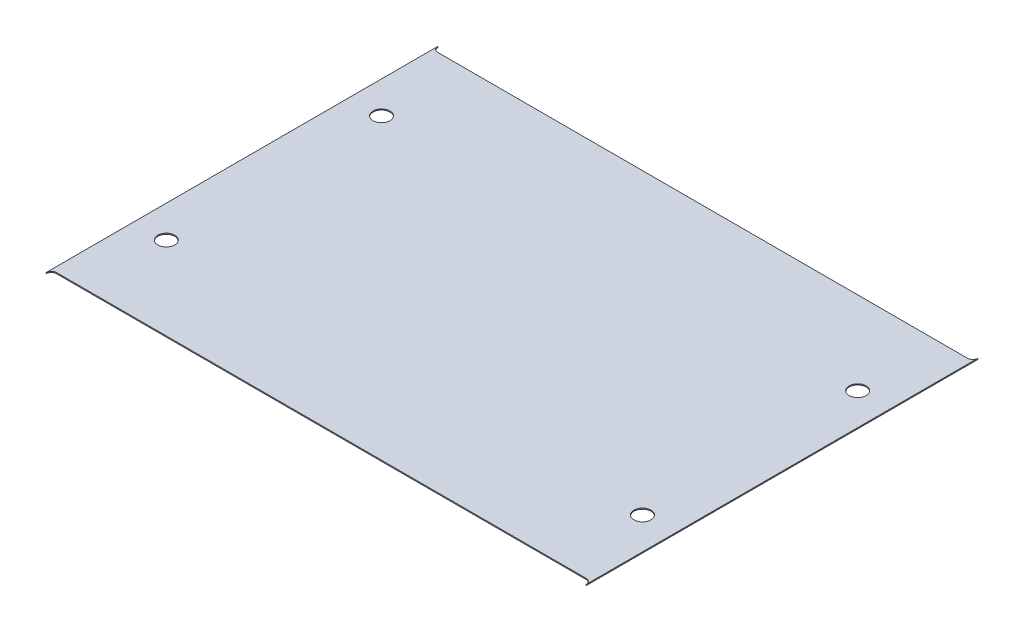
ISO-10303-21;
HEADER;
FILE_DESCRIPTION(('STEP AP214'),'2;1');
FILE_NAME('part.step','',(''),(''),'','','');
FILE_SCHEMA(('AUTOMOTIVE_DESIGN { 1 0 10303 214 1 1 1 1 }'));
ENDSEC;
DATA;
#1=APPLICATION_CONTEXT('core data for automotive mechanical design processes');
#2=APPLICATION_PROTOCOL_DEFINITION('international standard','automotive_design',2000,#1);
#3=PRODUCT_CONTEXT('',#1,'mechanical');
#4=PRODUCT('Part','Part','',(#3));
#5=PRODUCT_RELATED_PRODUCT_CATEGORY('part','',(#4));
#6=PRODUCT_DEFINITION_FORMATION('','',#4);
#7=PRODUCT_DEFINITION_CONTEXT('part definition',#1,'design');
#8=PRODUCT_DEFINITION('design','',#6,#7);
#9=PRODUCT_DEFINITION_SHAPE('','',#8);
#10=(LENGTH_UNIT() NAMED_UNIT(*) SI_UNIT(.MILLI.,.METRE.));
#11=(NAMED_UNIT(*) PLANE_ANGLE_UNIT() SI_UNIT($,.RADIAN.));
#12=(NAMED_UNIT(*) SI_UNIT($,.STERADIAN.) SOLID_ANGLE_UNIT());
#13=UNCERTAINTY_MEASURE_WITH_UNIT(LENGTH_MEASURE(1.E-05),#10,'distance_accuracy_value','');
#14=(GEOMETRIC_REPRESENTATION_CONTEXT(3) GLOBAL_UNCERTAINTY_ASSIGNED_CONTEXT((#13)) GLOBAL_UNIT_ASSIGNED_CONTEXT((#10,
#11,#12)) REPRESENTATION_CONTEXT('',''));
#15=CARTESIAN_POINT('',(0.,0.,0.));
#16=DIRECTION('',(0.,0.,1.));
#17=DIRECTION('',(1.,0.,0.));
#18=AXIS2_PLACEMENT_3D('',#15,#16,#17);
#19=CARTESIAN_POINT('',(-49.4289039708922,0.1,-21.9312755867609));
#20=DIRECTION('',(0.,1.,0.));
#21=DIRECTION('',(0.,0.,1.));
#22=AXIS2_PLACEMENT_3D('',#19,#20,#21);
#23=PLANE('',#22);
#24=CARTESIAN_POINT('',(-46.9089039708922,0.1,6.72872441323915));
#25=DIRECTION('',(0.,1.,0.));
#26=DIRECTION('',(0.,0.,1.));
#27=AXIS2_PLACEMENT_3D('',#24,#25,#26);
#28=CIRCLE('',#27,0.799999999999995);
#29=CARTESIAN_POINT('',(-46.9089039708922,0.1,7.52872441323914));
#30=VERTEX_POINT('',#29);
#31=EDGE_CURVE('E188',#30,#30,#28,.T.);
#32=ORIENTED_EDGE('',*,*,#31,.F.);
#33=EDGE_LOOP('',(#32));
#34=FACE_BOUND('',#33,.T.);
#35=CARTESIAN_POINT('',(-1.94890397089222,0.1,-13.5912755867609));
#36=DIRECTION('',(0.,1.,0.));
#37=DIRECTION('',(0.,0.,1.));
#38=AXIS2_PLACEMENT_3D('',#35,#36,#37);
#39=CIRCLE('',#38,0.799999999999999);
#40=CARTESIAN_POINT('',(-1.94890397089222,0.1,-12.7912755867609));
#41=VERTEX_POINT('',#40);
#42=EDGE_CURVE('E134',#41,#41,#39,.T.);
#43=ORIENTED_EDGE('',*,*,#42,.F.);
#44=EDGE_LOOP('',(#43));
#45=FACE_BOUND('',#44,.T.);
#46=CARTESIAN_POINT('',(-49.4289039708922,0.1,-21.9312755867609));
#47=DIRECTION('',(0.,-1.,0.));
#48=DIRECTION('',(0.,0.,1.));
#49=AXIS2_PLACEMENT_3D('',#46,#47,#48);
#50=CIRCLE('',#49,0.500000000000002);
#51=CARTESIAN_POINT('',(-49.4289039708922,0.1,-21.4312755867609));
#52=VERTEX_POINT('',#51);
#53=CARTESIAN_POINT('',(-49.9289039708922,0.1,-21.9312755867609));
#54=VERTEX_POINT('',#53);
#55=EDGE_CURVE('E145',#52,#54,#50,.T.);
#56=ORIENTED_EDGE('',*,*,#55,.T.);
#57=DIRECTION('',(0.,0.,1.));
#58=VECTOR('',#57,1.);
#59=CARTESIAN_POINT('',(-49.9289039708922,0.1,-21.9312755867609));
#60=LINE('',#59,#58);
#61=CARTESIAN_POINT('',(-49.9289039708922,0.1,15.0687244132391));
#62=VERTEX_POINT('',#61);
#63=EDGE_CURVE('E93',#54,#62,#60,.T.);
#64=ORIENTED_EDGE('',*,*,#63,.T.);
#65=CARTESIAN_POINT('',(-49.4289039708922,0.1,15.0687244132391));
#66=DIRECTION('',(0.,-1.,0.));
#67=DIRECTION('',(0.,0.,1.));
#68=AXIS2_PLACEMENT_3D('',#65,#66,#67);
#69=CIRCLE('',#68,0.5);
#70=CARTESIAN_POINT('',(-49.4289039708922,0.1,14.5687244132391));
#71=VERTEX_POINT('',#70);
#72=EDGE_CURVE('E160',#62,#71,#69,.T.);
#73=ORIENTED_EDGE('',*,*,#72,.T.);
#74=DIRECTION('',(1.,0.,0.));
#75=VECTOR('',#74,1.);
#76=CARTESIAN_POINT('',(-49.4289039708922,0.1,14.5687244132391));
#77=LINE('',#76,#75);
#78=CARTESIAN_POINT('',(0.571096029107789,0.1,14.5687244132391));
#79=VERTEX_POINT('',#78);
#80=EDGE_CURVE('E173',#71,#79,#77,.T.);
#81=ORIENTED_EDGE('',*,*,#80,.T.);
#82=CARTESIAN_POINT('',(0.571096029107789,0.1,15.0687244132391));
#83=DIRECTION('',(0.,-1.,0.));
#84=DIRECTION('',(0.,0.,1.));
#85=AXIS2_PLACEMENT_3D('',#82,#83,#84);
#86=CIRCLE('',#85,0.5);
#87=CARTESIAN_POINT('',(1.07109602910779,0.1,15.0687244132391));
#88=VERTEX_POINT('',#87);
#89=EDGE_CURVE('E112',#79,#88,#86,.T.);
#90=ORIENTED_EDGE('',*,*,#89,.T.);
#91=DIRECTION('',(0.,0.,-1.));
#92=VECTOR('',#91,1.);
#93=CARTESIAN_POINT('',(1.07109602910779,0.1,15.0687244132391));
#94=LINE('',#93,#92);
#95=CARTESIAN_POINT('',(1.07109602910779,0.1,-21.9312755867609));
#96=VERTEX_POINT('',#95);
#97=EDGE_CURVE('E106',#88,#96,#94,.T.);
#98=ORIENTED_EDGE('',*,*,#97,.T.);
#99=CARTESIAN_POINT('',(0.571096029107789,0.1,-21.9312755867609));
#100=DIRECTION('',(0.,-1.,0.));
#101=DIRECTION('',(0.,0.,1.));
#102=AXIS2_PLACEMENT_3D('',#99,#100,#101);
#103=CIRCLE('',#102,0.500000000000004);
#104=CARTESIAN_POINT('',(0.571096029107789,0.1,-21.4312755867609));
#105=VERTEX_POINT('',#104);
#106=EDGE_CURVE('E110',#96,#105,#103,.T.);
#107=ORIENTED_EDGE('',*,*,#106,.T.);
#108=DIRECTION('',(-1.,0.,0.));
#109=VECTOR('',#108,1.);
#110=CARTESIAN_POINT('',(0.571096029107789,0.1,-21.4312755867609));
#111=LINE('',#110,#109);
#112=EDGE_CURVE('E50',#105,#52,#111,.T.);
#113=ORIENTED_EDGE('',*,*,#112,.T.);
#114=EDGE_LOOP('',(#56,#64,#73,#81,#90,#98,#107,#113));
#115=FACE_BOUND('',#114,.T.);
#116=CARTESIAN_POINT('',(-46.9089039708922,0.1,-13.5912755867609));
#117=DIRECTION('',(0.,1.,0.));
#118=DIRECTION('',(0.,0.,1.));
#119=AXIS2_PLACEMENT_3D('',#116,#117,#118);
#120=CIRCLE('',#119,0.799999999999995);
#121=CARTESIAN_POINT('',(-46.9089039708922,0.1,-12.7912755867609));
#122=VERTEX_POINT('',#121);
#123=EDGE_CURVE('E182',#122,#122,#120,.T.);
#124=ORIENTED_EDGE('',*,*,#123,.F.);
#125=EDGE_LOOP('',(#124));
#126=FACE_BOUND('',#125,.T.);
#127=CARTESIAN_POINT('',(-1.94890397089221,0.1,6.72872441323915));
#128=DIRECTION('',(0.,1.,0.));
#129=DIRECTION('',(0.,0.,1.));
#130=AXIS2_PLACEMENT_3D('',#127,#128,#129);
#131=CIRCLE('',#130,0.799999999999998);
#132=CARTESIAN_POINT('',(-1.94890397089221,0.1,7.52872441323914));
#133=VERTEX_POINT('',#132);
#134=EDGE_CURVE('E194',#133,#133,#131,.T.);
#135=ORIENTED_EDGE('',*,*,#134,.F.);
#136=EDGE_LOOP('',(#135));
#137=FACE_BOUND('',#136,.T.);
#138=ADVANCED_FACE('F33',(#34,#45,#115,#126,#137),#23,.T.);
#139=CARTESIAN_POINT('',(-49.4289039708922,0.,-21.9312755867609));
#140=DIRECTION('',(0.,1.,0.));
#141=DIRECTION('',(0.,0.,1.));
#142=AXIS2_PLACEMENT_3D('',#139,#140,#141);
#143=PLANE('',#142);
#144=CARTESIAN_POINT('',(-49.4289039708922,0.,-21.9312755867609));
#145=DIRECTION('',(0.,-1.,0.));
#146=DIRECTION('',(0.,0.,1.));
#147=AXIS2_PLACEMENT_3D('',#144,#145,#146);
#148=CIRCLE('',#147,0.500000000000002);
#149=CARTESIAN_POINT('',(-49.4289039708922,0.,-21.4312755867609));
#150=VERTEX_POINT('',#149);
#151=CARTESIAN_POINT('',(-49.9289039708922,0.,-21.9312755867609));
#152=VERTEX_POINT('',#151);
#153=EDGE_CURVE('E130',#150,#152,#148,.T.);
#154=ORIENTED_EDGE('',*,*,#153,.F.);
#155=DIRECTION('',(-1.,0.,0.));
#156=VECTOR('',#155,1.);
#157=CARTESIAN_POINT('',(0.571096029107789,0.,-21.4312755867609));
#158=LINE('',#157,#156);
#159=CARTESIAN_POINT('',(0.571096029107789,0.,-21.4312755867609));
#160=VERTEX_POINT('',#159);
#161=EDGE_CURVE('E85',#160,#150,#158,.T.);
#162=ORIENTED_EDGE('',*,*,#161,.F.);
#163=CARTESIAN_POINT('',(0.571096029107789,0.,-21.9312755867609));
#164=DIRECTION('',(0.,-1.,0.));
#165=DIRECTION('',(0.,0.,1.));
#166=AXIS2_PLACEMENT_3D('',#163,#164,#165);
#167=CIRCLE('',#166,0.500000000000004);
#168=CARTESIAN_POINT('',(1.07109602910779,0.,-21.9312755867609));
#169=VERTEX_POINT('',#168);
#170=EDGE_CURVE('E79',#169,#160,#167,.T.);
#171=ORIENTED_EDGE('',*,*,#170,.F.);
#172=DIRECTION('',(0.,0.,-1.));
#173=VECTOR('',#172,1.);
#174=CARTESIAN_POINT('',(1.07109602910779,0.,15.0687244132391));
#175=LINE('',#174,#173);
#176=CARTESIAN_POINT('',(1.07109602910779,0.,15.0687244132391));
#177=VERTEX_POINT('',#176);
#178=EDGE_CURVE('E120',#177,#169,#175,.T.);
#179=ORIENTED_EDGE('',*,*,#178,.F.);
#180=CARTESIAN_POINT('',(0.571096029107789,0.,15.0687244132391));
#181=DIRECTION('',(0.,-1.,0.));
#182=DIRECTION('',(0.,0.,1.));
#183=AXIS2_PLACEMENT_3D('',#180,#181,#182);
#184=CIRCLE('',#183,0.5);
#185=CARTESIAN_POINT('',(0.571096029107789,0.,14.5687244132391));
#186=VERTEX_POINT('',#185);
#187=EDGE_CURVE('E140',#186,#177,#184,.T.);
#188=ORIENTED_EDGE('',*,*,#187,.F.);
#189=DIRECTION('',(1.,0.,0.));
#190=VECTOR('',#189,1.);
#191=CARTESIAN_POINT('',(-49.4289039708922,0.,14.5687244132391));
#192=LINE('',#191,#190);
#193=CARTESIAN_POINT('',(-49.4289039708922,0.,14.5687244132391));
#194=VERTEX_POINT('',#193);
#195=EDGE_CURVE('E138',#194,#186,#192,.T.);
#196=ORIENTED_EDGE('',*,*,#195,.F.);
#197=CARTESIAN_POINT('',(-49.4289039708922,0.,15.0687244132391));
#198=DIRECTION('',(0.,-1.,0.));
#199=DIRECTION('',(0.,0.,1.));
#200=AXIS2_PLACEMENT_3D('',#197,#198,#199);
#201=CIRCLE('',#200,0.5);
#202=CARTESIAN_POINT('',(-49.9289039708922,0.,15.0687244132391));
#203=VERTEX_POINT('',#202);
#204=EDGE_CURVE('E136',#203,#194,#201,.T.);
#205=ORIENTED_EDGE('',*,*,#204,.F.);
#206=DIRECTION('',(0.,0.,1.));
#207=VECTOR('',#206,1.);
#208=CARTESIAN_POINT('',(-49.9289039708922,0.,-21.9312755867609));
#209=LINE('',#208,#207);
#210=EDGE_CURVE('E133',#152,#203,#209,.T.);
#211=ORIENTED_EDGE('',*,*,#210,.F.);
#212=EDGE_LOOP('',(#154,#162,#171,#179,#188,#196,#205,#211));
#213=FACE_BOUND('',#212,.T.);
#214=CARTESIAN_POINT('',(-1.94890397089222,0.,-13.5912755867609));
#215=DIRECTION('',(0.,1.,0.));
#216=DIRECTION('',(0.,0.,1.));
#217=AXIS2_PLACEMENT_3D('',#214,#215,#216);
#218=CIRCLE('',#217,0.799999999999999);
#219=CARTESIAN_POINT('',(-1.94890397089222,0.,-12.7912755867609));
#220=VERTEX_POINT('',#219);
#221=EDGE_CURVE('E179',#220,#220,#218,.T.);
#222=ORIENTED_EDGE('',*,*,#221,.T.);
#223=EDGE_LOOP('',(#222));
#224=FACE_BOUND('',#223,.T.);
#225=CARTESIAN_POINT('',(-46.9089039708922,0.,-13.5912755867609));
#226=DIRECTION('',(0.,1.,0.));
#227=DIRECTION('',(0.,0.,1.));
#228=AXIS2_PLACEMENT_3D('',#225,#226,#227);
#229=CIRCLE('',#228,0.799999999999995);
#230=CARTESIAN_POINT('',(-46.9089039708922,0.,-12.7912755867609));
#231=VERTEX_POINT('',#230);
#232=EDGE_CURVE('E185',#231,#231,#229,.T.);
#233=ORIENTED_EDGE('',*,*,#232,.T.);
#234=EDGE_LOOP('',(#233));
#235=FACE_BOUND('',#234,.T.);
#236=CARTESIAN_POINT('',(-46.9089039708922,0.,6.72872441323915));
#237=DIRECTION('',(0.,1.,0.));
#238=DIRECTION('',(0.,0.,1.));
#239=AXIS2_PLACEMENT_3D('',#236,#237,#238);
#240=CIRCLE('',#239,0.799999999999995);
#241=CARTESIAN_POINT('',(-46.9089039708922,0.,7.52872441323914));
#242=VERTEX_POINT('',#241);
#243=EDGE_CURVE('E191',#242,#242,#240,.T.);
#244=ORIENTED_EDGE('',*,*,#243,.T.);
#245=EDGE_LOOP('',(#244));
#246=FACE_BOUND('',#245,.T.);
#247=CARTESIAN_POINT('',(-1.94890397089221,0.,6.72872441323915));
#248=DIRECTION('',(0.,1.,0.));
#249=DIRECTION('',(0.,0.,1.));
#250=AXIS2_PLACEMENT_3D('',#247,#248,#249);
#251=CIRCLE('',#250,0.799999999999998);
#252=CARTESIAN_POINT('',(-1.94890397089221,0.,7.52872441323914));
#253=VERTEX_POINT('',#252);
#254=EDGE_CURVE('E197',#253,#253,#251,.T.);
#255=ORIENTED_EDGE('',*,*,#254,.T.);
#256=EDGE_LOOP('',(#255));
#257=FACE_BOUND('',#256,.T.);
#258=ADVANCED_FACE('F164',(#213,#224,#235,#246,#257),#143,.F.);
#259=CARTESIAN_POINT('',(-49.4289039708922,0.1,-21.9312755867609));
#260=DIRECTION('',(0.,-1.,0.));
#261=DIRECTION('',(0.,0.,-1.));
#262=AXIS2_PLACEMENT_3D('',#259,#260,#261);
#263=CYLINDRICAL_SURFACE('',#262,0.500000000000002);
#264=ORIENTED_EDGE('',*,*,#153,.T.);
#265=DIRECTION('',(0.,-1.,0.));
#266=VECTOR('',#265,1.);
#267=CARTESIAN_POINT('',(-49.9289039708922,0.1,-21.9312755867609));
#268=LINE('',#267,#266);
#269=EDGE_CURVE('E11',#54,#152,#268,.T.);
#270=ORIENTED_EDGE('',*,*,#269,.F.);
#271=ORIENTED_EDGE('',*,*,#55,.F.);
#272=DIRECTION('',(0.,-1.,0.));
#273=VECTOR('',#272,1.);
#274=CARTESIAN_POINT('',(-49.4289039708922,0.1,-21.4312755867609));
#275=LINE('',#274,#273);
#276=EDGE_CURVE('E126',#52,#150,#275,.T.);
#277=ORIENTED_EDGE('',*,*,#276,.T.);
#278=EDGE_LOOP('',(#264,#270,#271,#277));
#279=FACE_BOUND('',#278,.T.);
#280=ADVANCED_FACE('F35',(#279),#263,.F.);
#281=CARTESIAN_POINT('',(-49.9289039708922,0.1,-21.9312755867609));
#282=DIRECTION('',(1.,0.,0.));
#283=DIRECTION('',(0.,0.,-1.));
#284=AXIS2_PLACEMENT_3D('',#281,#282,#283);
#285=PLANE('',#284);
#286=ORIENTED_EDGE('',*,*,#210,.T.);
#287=DIRECTION('',(0.,-1.,0.));
#288=VECTOR('',#287,1.);
#289=CARTESIAN_POINT('',(-49.9289039708922,0.1,15.0687244132391));
#290=LINE('',#289,#288);
#291=EDGE_CURVE('E42',#62,#203,#290,.T.);
#292=ORIENTED_EDGE('',*,*,#291,.F.);
#293=ORIENTED_EDGE('',*,*,#63,.F.);
#294=ORIENTED_EDGE('',*,*,#269,.T.);
#295=EDGE_LOOP('',(#286,#292,#293,#294));
#296=FACE_BOUND('',#295,.T.);
#297=ADVANCED_FACE('F231',(#296),#285,.F.);
#298=CARTESIAN_POINT('',(-49.4289039708922,0.1,15.0687244132391));
#299=DIRECTION('',(0.,-1.,0.));
#300=DIRECTION('',(0.,0.,-1.));
#301=AXIS2_PLACEMENT_3D('',#298,#299,#300);
#302=CYLINDRICAL_SURFACE('',#301,0.5);
#303=ORIENTED_EDGE('',*,*,#204,.T.);
#304=DIRECTION('',(0.,-1.,0.));
#305=VECTOR('',#304,1.);
#306=CARTESIAN_POINT('',(-49.4289039708922,0.1,14.5687244132391));
#307=LINE('',#306,#305);
#308=EDGE_CURVE('E152',#71,#194,#307,.T.);
#309=ORIENTED_EDGE('',*,*,#308,.F.);
#310=ORIENTED_EDGE('',*,*,#72,.F.);
#311=ORIENTED_EDGE('',*,*,#291,.T.);
#312=EDGE_LOOP('',(#303,#309,#310,#311));
#313=FACE_BOUND('',#312,.T.);
#314=ADVANCED_FACE('F158',(#313),#302,.F.);
#315=CARTESIAN_POINT('',(-49.4289039708922,0.1,14.5687244132391));
#316=DIRECTION('',(0.,0.,-1.));
#317=DIRECTION('',(-1.,0.,0.));
#318=AXIS2_PLACEMENT_3D('',#315,#316,#317);
#319=PLANE('',#318);
#320=ORIENTED_EDGE('',*,*,#195,.T.);
#321=DIRECTION('',(0.,-1.,0.));
#322=VECTOR('',#321,1.);
#323=CARTESIAN_POINT('',(0.571096029107789,0.1,14.5687244132391));
#324=LINE('',#323,#322);
#325=EDGE_CURVE('E149',#79,#186,#324,.T.);
#326=ORIENTED_EDGE('',*,*,#325,.F.);
#327=ORIENTED_EDGE('',*,*,#80,.F.);
#328=ORIENTED_EDGE('',*,*,#308,.T.);
#329=EDGE_LOOP('',(#320,#326,#327,#328));
#330=FACE_BOUND('',#329,.T.);
#331=ADVANCED_FACE('F169',(#330),#319,.F.);
#332=CARTESIAN_POINT('',(0.571096029107789,0.1,15.0687244132391));
#333=DIRECTION('',(0.,-1.,0.));
#334=DIRECTION('',(0.,0.,-1.));
#335=AXIS2_PLACEMENT_3D('',#332,#333,#334);
#336=CYLINDRICAL_SURFACE('',#335,0.5);
#337=ORIENTED_EDGE('',*,*,#187,.T.);
#338=DIRECTION('',(0.,-1.,0.));
#339=VECTOR('',#338,1.);
#340=CARTESIAN_POINT('',(1.07109602910779,0.1,15.0687244132391));
#341=LINE('',#340,#339);
#342=EDGE_CURVE('E121',#88,#177,#341,.T.);
#343=ORIENTED_EDGE('',*,*,#342,.F.);
#344=ORIENTED_EDGE('',*,*,#89,.F.);
#345=ORIENTED_EDGE('',*,*,#325,.T.);
#346=EDGE_LOOP('',(#337,#343,#344,#345));
#347=FACE_BOUND('',#346,.T.);
#348=ADVANCED_FACE('F172',(#347),#336,.F.);
#349=CARTESIAN_POINT('',(1.07109602910779,0.1,15.0687244132391));
#350=DIRECTION('',(-1.,0.,0.));
#351=DIRECTION('',(0.,0.,1.));
#352=AXIS2_PLACEMENT_3D('',#349,#350,#351);
#353=PLANE('',#352);
#354=ORIENTED_EDGE('',*,*,#178,.T.);
#355=DIRECTION('',(0.,-1.,0.));
#356=VECTOR('',#355,1.);
#357=CARTESIAN_POINT('',(1.07109602910779,0.1,-21.9312755867609));
#358=LINE('',#357,#356);
#359=EDGE_CURVE('E117',#96,#169,#358,.T.);
#360=ORIENTED_EDGE('',*,*,#359,.F.);
#361=ORIENTED_EDGE('',*,*,#97,.F.);
#362=ORIENTED_EDGE('',*,*,#342,.T.);
#363=EDGE_LOOP('',(#354,#360,#361,#362));
#364=FACE_BOUND('',#363,.T.);
#365=ADVANCED_FACE('F118',(#364),#353,.F.);
#366=CARTESIAN_POINT('',(0.571096029107789,0.1,-21.9312755867609));
#367=DIRECTION('',(0.,-1.,0.));
#368=DIRECTION('',(0.,0.,-1.));
#369=AXIS2_PLACEMENT_3D('',#366,#367,#368);
#370=CYLINDRICAL_SURFACE('',#369,0.500000000000004);
#371=ORIENTED_EDGE('',*,*,#170,.T.);
#372=DIRECTION('',(0.,-1.,0.));
#373=VECTOR('',#372,1.);
#374=CARTESIAN_POINT('',(0.571096029107789,0.1,-21.4312755867609));
#375=LINE('',#374,#373);
#376=EDGE_CURVE('E122',#105,#160,#375,.T.);
#377=ORIENTED_EDGE('',*,*,#376,.F.);
#378=ORIENTED_EDGE('',*,*,#106,.F.);
#379=ORIENTED_EDGE('',*,*,#359,.T.);
#380=EDGE_LOOP('',(#371,#377,#378,#379));
#381=FACE_BOUND('',#380,.T.);
#382=ADVANCED_FACE('F124',(#381),#370,.F.);
#383=CARTESIAN_POINT('',(0.571096029107789,0.1,-21.4312755867609));
#384=DIRECTION('',(0.,0.,1.));
#385=DIRECTION('',(1.,0.,0.));
#386=AXIS2_PLACEMENT_3D('',#383,#384,#385);
#387=PLANE('',#386);
#388=ORIENTED_EDGE('',*,*,#161,.T.);
#389=ORIENTED_EDGE('',*,*,#276,.F.);
#390=ORIENTED_EDGE('',*,*,#112,.F.);
#391=ORIENTED_EDGE('',*,*,#376,.T.);
#392=EDGE_LOOP('',(#388,#389,#390,#391));
#393=FACE_BOUND('',#392,.T.);
#394=ADVANCED_FACE('F219',(#393),#387,.F.);
#395=CARTESIAN_POINT('',(-1.94890397089222,0.1,-13.5912755867609));
#396=DIRECTION('',(0.,-1.,0.));
#397=DIRECTION('',(0.,0.,-1.));
#398=AXIS2_PLACEMENT_3D('',#395,#396,#397);
#399=CYLINDRICAL_SURFACE('',#398,0.799999999999999);
#400=ORIENTED_EDGE('',*,*,#42,.T.);
#401=EDGE_LOOP('',(#400));
#402=FACE_BOUND('',#401,.T.);
#403=ORIENTED_EDGE('',*,*,#221,.F.);
#404=EDGE_LOOP('',(#403));
#405=FACE_BOUND('',#404,.T.);
#406=ADVANCED_FACE('F216',(#402,#405),#399,.F.);
#407=CARTESIAN_POINT('',(-46.9089039708922,0.1,-13.5912755867609));
#408=DIRECTION('',(0.,-1.,0.));
#409=DIRECTION('',(0.,0.,-1.));
#410=AXIS2_PLACEMENT_3D('',#407,#408,#409);
#411=CYLINDRICAL_SURFACE('',#410,0.799999999999995);
#412=ORIENTED_EDGE('',*,*,#123,.T.);
#413=EDGE_LOOP('',(#412));
#414=FACE_BOUND('',#413,.T.);
#415=ORIENTED_EDGE('',*,*,#232,.F.);
#416=EDGE_LOOP('',(#415));
#417=FACE_BOUND('',#416,.T.);
#418=ADVANCED_FACE('F295',(#414,#417),#411,.F.);
#419=CARTESIAN_POINT('',(-46.9089039708922,0.1,6.72872441323915));
#420=DIRECTION('',(0.,-1.,0.));
#421=DIRECTION('',(0.,0.,-1.));
#422=AXIS2_PLACEMENT_3D('',#419,#420,#421);
#423=CYLINDRICAL_SURFACE('',#422,0.799999999999995);
#424=ORIENTED_EDGE('',*,*,#31,.T.);
#425=EDGE_LOOP('',(#424));
#426=FACE_BOUND('',#425,.T.);
#427=ORIENTED_EDGE('',*,*,#243,.F.);
#428=EDGE_LOOP('',(#427));
#429=FACE_BOUND('',#428,.T.);
#430=ADVANCED_FACE('F303',(#426,#429),#423,.F.);
#431=CARTESIAN_POINT('',(-1.94890397089221,0.1,6.72872441323915));
#432=DIRECTION('',(0.,-1.,0.));
#433=DIRECTION('',(0.,0.,-1.));
#434=AXIS2_PLACEMENT_3D('',#431,#432,#433);
#435=CYLINDRICAL_SURFACE('',#434,0.799999999999998);
#436=ORIENTED_EDGE('',*,*,#134,.T.);
#437=EDGE_LOOP('',(#436));
#438=FACE_BOUND('',#437,.T.);
#439=ORIENTED_EDGE('',*,*,#254,.F.);
#440=EDGE_LOOP('',(#439));
#441=FACE_BOUND('',#440,.T.);
#442=ADVANCED_FACE('F203',(#438,#441),#435,.F.);
#443=CLOSED_SHELL('',(#138,#258,#280,#297,#314,#331,#348,#365,#382,#394,#406,#418,#430,#442));
#444=MANIFOLD_SOLID_BREP('B2',#443);
#445=ADVANCED_BREP_SHAPE_REPRESENTATION('',(#18,#444),#14);
#446=SHAPE_DEFINITION_REPRESENTATION(#9,#445);
ENDSEC;
END-ISO-10303-21;
